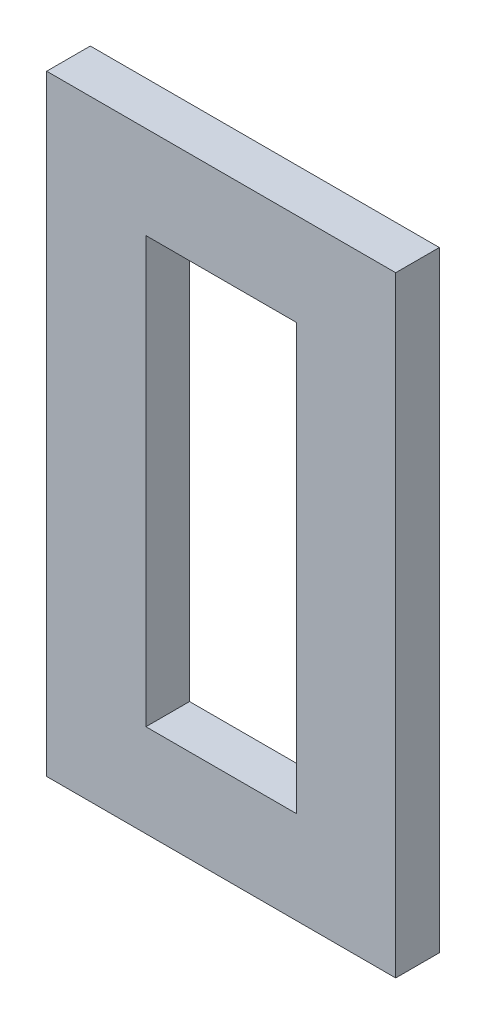
ISO-10303-21;
HEADER;
FILE_DESCRIPTION(('STEP AP214'),'2;1');
FILE_NAME('part.step','',(''),(''),'','','');
FILE_SCHEMA(('AUTOMOTIVE_DESIGN { 1 0 10303 214 1 1 1 1 }'));
ENDSEC;
DATA;
#1=APPLICATION_CONTEXT('core data for automotive mechanical design processes');
#2=APPLICATION_PROTOCOL_DEFINITION('international standard','automotive_design',2000,#1);
#3=PRODUCT_CONTEXT('',#1,'mechanical');
#4=PRODUCT('Part','Part','',(#3));
#5=PRODUCT_RELATED_PRODUCT_CATEGORY('part','',(#4));
#6=PRODUCT_DEFINITION_FORMATION('','',#4);
#7=PRODUCT_DEFINITION_CONTEXT('part definition',#1,'design');
#8=PRODUCT_DEFINITION('design','',#6,#7);
#9=PRODUCT_DEFINITION_SHAPE('','',#8);
#10=(LENGTH_UNIT() NAMED_UNIT(*) SI_UNIT(.MILLI.,.METRE.));
#11=(NAMED_UNIT(*) PLANE_ANGLE_UNIT() SI_UNIT($,.RADIAN.));
#12=(NAMED_UNIT(*) SI_UNIT($,.STERADIAN.) SOLID_ANGLE_UNIT());
#13=UNCERTAINTY_MEASURE_WITH_UNIT(LENGTH_MEASURE(1.E-05),#10,'distance_accuracy_value','');
#14=(GEOMETRIC_REPRESENTATION_CONTEXT(3) GLOBAL_UNCERTAINTY_ASSIGNED_CONTEXT((#13)) GLOBAL_UNIT_ASSIGNED_CONTEXT((#10,
#11,#12)) REPRESENTATION_CONTEXT('',''));
#15=CARTESIAN_POINT('',(0.,0.,0.));
#16=DIRECTION('',(0.,0.,1.));
#17=DIRECTION('',(1.,0.,0.));
#18=AXIS2_PLACEMENT_3D('',#15,#16,#17);
#19=CARTESIAN_POINT('',(0.,0.,20.));
#20=DIRECTION('',(0.,0.,-1.));
#21=DIRECTION('',(-1.,0.,0.));
#22=AXIS2_PLACEMENT_3D('',#19,#20,#21);
#23=PLANE('',#22);
#24=DIRECTION('',(0.,-1.,0.));
#25=VECTOR('',#24,1.);
#26=CARTESIAN_POINT('',(-291.827956989247,-140.,20.));
#27=LINE('',#26,#25);
#28=CARTESIAN_POINT('',(-291.827956989247,140.,20.));
#29=VERTEX_POINT('',#28);
#30=CARTESIAN_POINT('',(-291.827956989247,-140.,20.));
#31=VERTEX_POINT('',#30);
#32=EDGE_CURVE('E142',#29,#31,#27,.T.);
#33=ORIENTED_EDGE('',*,*,#32,.T.);
#34=DIRECTION('',(1.,0.,0.));
#35=VECTOR('',#34,1.);
#36=CARTESIAN_POINT('',(-131.827956989247,-140.,20.));
#37=LINE('',#36,#35);
#38=CARTESIAN_POINT('',(-131.827956989247,-140.,20.));
#39=VERTEX_POINT('',#38);
#40=EDGE_CURVE('E145',#31,#39,#37,.T.);
#41=ORIENTED_EDGE('',*,*,#40,.T.);
#42=DIRECTION('',(0.,1.,0.));
#43=VECTOR('',#42,1.);
#44=CARTESIAN_POINT('',(-131.827956989247,140.,20.));
#45=LINE('',#44,#43);
#46=CARTESIAN_POINT('',(-131.827956989247,140.,20.));
#47=VERTEX_POINT('',#46);
#48=EDGE_CURVE('E148',#39,#47,#45,.T.);
#49=ORIENTED_EDGE('',*,*,#48,.T.);
#50=DIRECTION('',(-1.,0.,0.));
#51=VECTOR('',#50,1.);
#52=CARTESIAN_POINT('',(-291.827956989247,140.,20.));
#53=LINE('',#52,#51);
#54=EDGE_CURVE('E150',#47,#29,#53,.T.);
#55=ORIENTED_EDGE('',*,*,#54,.T.);
#56=EDGE_LOOP('',(#33,#41,#49,#55));
#57=FACE_BOUND('',#56,.T.);
#58=DIRECTION('',(0.,1.,0.));
#59=VECTOR('',#58,1.);
#60=CARTESIAN_POINT('',(-177.327956989247,97.5,20.));
#61=LINE('',#60,#59);
#62=CARTESIAN_POINT('',(-177.327956989247,-97.5,20.));
#63=VERTEX_POINT('',#62);
#64=CARTESIAN_POINT('',(-177.327956989247,97.5,20.));
#65=VERTEX_POINT('',#64);
#66=EDGE_CURVE('E106',#63,#65,#61,.T.);
#67=ORIENTED_EDGE('',*,*,#66,.F.);
#68=DIRECTION('',(1.,0.,0.));
#69=VECTOR('',#68,1.);
#70=CARTESIAN_POINT('',(-246.327956989247,-97.5,20.));
#71=LINE('',#70,#69);
#72=CARTESIAN_POINT('',(-246.327956989247,-97.5,20.));
#73=VERTEX_POINT('',#72);
#74=EDGE_CURVE('E128',#73,#63,#71,.T.);
#75=ORIENTED_EDGE('',*,*,#74,.F.);
#76=DIRECTION('',(0.,-1.,0.));
#77=VECTOR('',#76,1.);
#78=CARTESIAN_POINT('',(-246.327956989247,97.5,20.));
#79=LINE('',#78,#77);
#80=CARTESIAN_POINT('',(-246.327956989247,97.5,20.));
#81=VERTEX_POINT('',#80);
#82=EDGE_CURVE('E126',#81,#73,#79,.T.);
#83=ORIENTED_EDGE('',*,*,#82,.F.);
#84=DIRECTION('',(-1.,0.,0.));
#85=VECTOR('',#84,1.);
#86=CARTESIAN_POINT('',(-246.327956989247,97.5,20.));
#87=LINE('',#86,#85);
#88=EDGE_CURVE('E114',#65,#81,#87,.T.);
#89=ORIENTED_EDGE('',*,*,#88,.F.);
#90=EDGE_LOOP('',(#67,#75,#83,#89));
#91=FACE_BOUND('',#90,.T.);
#92=ADVANCED_FACE('F41',(#57,#91),#23,.F.);
#93=CARTESIAN_POINT('',(0.,0.,0.));
#94=DIRECTION('',(0.,0.,-1.));
#95=DIRECTION('',(-1.,0.,0.));
#96=AXIS2_PLACEMENT_3D('',#93,#94,#95);
#97=PLANE('',#96);
#98=DIRECTION('',(0.,-1.,0.));
#99=VECTOR('',#98,1.);
#100=CARTESIAN_POINT('',(-291.827956989247,-140.,0.));
#101=LINE('',#100,#99);
#102=CARTESIAN_POINT('',(-291.827956989247,140.,0.));
#103=VERTEX_POINT('',#102);
#104=CARTESIAN_POINT('',(-291.827956989247,-140.,0.));
#105=VERTEX_POINT('',#104);
#106=EDGE_CURVE('E122',#103,#105,#101,.T.);
#107=ORIENTED_EDGE('',*,*,#106,.F.);
#108=DIRECTION('',(-1.,0.,0.));
#109=VECTOR('',#108,1.);
#110=CARTESIAN_POINT('',(-291.827956989247,140.,0.));
#111=LINE('',#110,#109);
#112=CARTESIAN_POINT('',(-131.827956989247,140.,0.));
#113=VERTEX_POINT('',#112);
#114=EDGE_CURVE('E146',#113,#103,#111,.T.);
#115=ORIENTED_EDGE('',*,*,#114,.F.);
#116=DIRECTION('',(0.,1.,0.));
#117=VECTOR('',#116,1.);
#118=CARTESIAN_POINT('',(-131.827956989247,140.,0.));
#119=LINE('',#118,#117);
#120=CARTESIAN_POINT('',(-131.827956989247,-140.,0.));
#121=VERTEX_POINT('',#120);
#122=EDGE_CURVE('E157',#121,#113,#119,.T.);
#123=ORIENTED_EDGE('',*,*,#122,.F.);
#124=DIRECTION('',(1.,0.,0.));
#125=VECTOR('',#124,1.);
#126=CARTESIAN_POINT('',(-131.827956989247,-140.,0.));
#127=LINE('',#126,#125);
#128=EDGE_CURVE('E155',#105,#121,#127,.T.);
#129=ORIENTED_EDGE('',*,*,#128,.F.);
#130=EDGE_LOOP('',(#107,#115,#123,#129));
#131=FACE_BOUND('',#130,.T.);
#132=DIRECTION('',(1.,0.,0.));
#133=VECTOR('',#132,1.);
#134=CARTESIAN_POINT('',(-246.327956989247,-97.5,0.));
#135=LINE('',#134,#133);
#136=CARTESIAN_POINT('',(-246.327956989247,-97.5,0.));
#137=VERTEX_POINT('',#136);
#138=CARTESIAN_POINT('',(-177.327956989247,-97.5,0.));
#139=VERTEX_POINT('',#138);
#140=EDGE_CURVE('E115',#137,#139,#135,.T.);
#141=ORIENTED_EDGE('',*,*,#140,.T.);
#142=DIRECTION('',(0.,1.,0.));
#143=VECTOR('',#142,1.);
#144=CARTESIAN_POINT('',(-177.327956989247,97.5,0.));
#145=LINE('',#144,#143);
#146=CARTESIAN_POINT('',(-177.327956989247,97.5,0.));
#147=VERTEX_POINT('',#146);
#148=EDGE_CURVE('E64',#139,#147,#145,.T.);
#149=ORIENTED_EDGE('',*,*,#148,.T.);
#150=DIRECTION('',(-1.,0.,0.));
#151=VECTOR('',#150,1.);
#152=CARTESIAN_POINT('',(-246.327956989247,97.5,0.));
#153=LINE('',#152,#151);
#154=CARTESIAN_POINT('',(-246.327956989247,97.5,0.));
#155=VERTEX_POINT('',#154);
#156=EDGE_CURVE('E121',#147,#155,#153,.T.);
#157=ORIENTED_EDGE('',*,*,#156,.T.);
#158=DIRECTION('',(0.,-1.,0.));
#159=VECTOR('',#158,1.);
#160=CARTESIAN_POINT('',(-246.327956989247,97.5,0.));
#161=LINE('',#160,#159);
#162=EDGE_CURVE('E134',#155,#137,#161,.T.);
#163=ORIENTED_EDGE('',*,*,#162,.T.);
#164=EDGE_LOOP('',(#141,#149,#157,#163));
#165=FACE_BOUND('',#164,.T.);
#166=ADVANCED_FACE('F175',(#131,#165),#97,.T.);
#167=CARTESIAN_POINT('',(-291.827956989247,-140.,20.));
#168=DIRECTION('',(1.,0.,0.));
#169=DIRECTION('',(0.,0.,-1.));
#170=AXIS2_PLACEMENT_3D('',#167,#168,#169);
#171=PLANE('',#170);
#172=ORIENTED_EDGE('',*,*,#106,.T.);
#173=DIRECTION('',(0.,0.,-1.));
#174=VECTOR('',#173,1.);
#175=CARTESIAN_POINT('',(-291.827956989247,-140.,20.));
#176=LINE('',#175,#174);
#177=EDGE_CURVE('E11',#31,#105,#176,.T.);
#178=ORIENTED_EDGE('',*,*,#177,.F.);
#179=ORIENTED_EDGE('',*,*,#32,.F.);
#180=DIRECTION('',(0.,0.,-1.));
#181=VECTOR('',#180,1.);
#182=CARTESIAN_POINT('',(-291.827956989247,140.,20.));
#183=LINE('',#182,#181);
#184=EDGE_CURVE('E152',#29,#103,#183,.T.);
#185=ORIENTED_EDGE('',*,*,#184,.T.);
#186=EDGE_LOOP('',(#172,#178,#179,#185));
#187=FACE_BOUND('',#186,.T.);
#188=ADVANCED_FACE('F43',(#187),#171,.F.);
#189=CARTESIAN_POINT('',(-131.827956989247,-140.,20.));
#190=DIRECTION('',(0.,1.,0.));
#191=DIRECTION('',(0.,0.,1.));
#192=AXIS2_PLACEMENT_3D('',#189,#190,#191);
#193=PLANE('',#192);
#194=ORIENTED_EDGE('',*,*,#128,.T.);
#195=DIRECTION('',(0.,0.,-1.));
#196=VECTOR('',#195,1.);
#197=CARTESIAN_POINT('',(-131.827956989247,-140.,20.));
#198=LINE('',#197,#196);
#199=EDGE_CURVE('E49',#39,#121,#198,.T.);
#200=ORIENTED_EDGE('',*,*,#199,.F.);
#201=ORIENTED_EDGE('',*,*,#40,.F.);
#202=ORIENTED_EDGE('',*,*,#177,.T.);
#203=EDGE_LOOP('',(#194,#200,#201,#202));
#204=FACE_BOUND('',#203,.T.);
#205=ADVANCED_FACE('F185',(#204),#193,.F.);
#206=CARTESIAN_POINT('',(-131.827956989247,140.,20.));
#207=DIRECTION('',(-1.,0.,0.));
#208=DIRECTION('',(0.,-1.,0.));
#209=AXIS2_PLACEMENT_3D('',#206,#207,#208);
#210=PLANE('',#209);
#211=ORIENTED_EDGE('',*,*,#122,.T.);
#212=DIRECTION('',(0.,0.,-1.));
#213=VECTOR('',#212,1.);
#214=CARTESIAN_POINT('',(-131.827956989247,140.,20.));
#215=LINE('',#214,#213);
#216=EDGE_CURVE('E162',#47,#113,#215,.T.);
#217=ORIENTED_EDGE('',*,*,#216,.F.);
#218=ORIENTED_EDGE('',*,*,#48,.F.);
#219=ORIENTED_EDGE('',*,*,#199,.T.);
#220=EDGE_LOOP('',(#211,#217,#218,#219));
#221=FACE_BOUND('',#220,.T.);
#222=ADVANCED_FACE('F169',(#221),#210,.F.);
#223=CARTESIAN_POINT('',(-291.827956989247,140.,20.));
#224=DIRECTION('',(0.,-1.,0.));
#225=DIRECTION('',(0.,0.,-1.));
#226=AXIS2_PLACEMENT_3D('',#223,#224,#225);
#227=PLANE('',#226);
#228=ORIENTED_EDGE('',*,*,#114,.T.);
#229=ORIENTED_EDGE('',*,*,#184,.F.);
#230=ORIENTED_EDGE('',*,*,#54,.F.);
#231=ORIENTED_EDGE('',*,*,#216,.T.);
#232=EDGE_LOOP('',(#228,#229,#230,#231));
#233=FACE_BOUND('',#232,.T.);
#234=ADVANCED_FACE('F179',(#233),#227,.F.);
#235=CARTESIAN_POINT('',(-177.327956989247,97.5,20.));
#236=DIRECTION('',(-1.,0.,0.));
#237=DIRECTION('',(0.,-1.,0.));
#238=AXIS2_PLACEMENT_3D('',#235,#236,#237);
#239=PLANE('',#238);
#240=ORIENTED_EDGE('',*,*,#148,.F.);
#241=DIRECTION('',(0.,0.,-1.));
#242=VECTOR('',#241,1.);
#243=CARTESIAN_POINT('',(-177.327956989247,-97.5,20.));
#244=LINE('',#243,#242);
#245=EDGE_CURVE('E110',#63,#139,#244,.T.);
#246=ORIENTED_EDGE('',*,*,#245,.F.);
#247=ORIENTED_EDGE('',*,*,#66,.T.);
#248=DIRECTION('',(0.,0.,-1.));
#249=VECTOR('',#248,1.);
#250=CARTESIAN_POINT('',(-177.327956989247,97.5,20.));
#251=LINE('',#250,#249);
#252=EDGE_CURVE('E109',#65,#147,#251,.T.);
#253=ORIENTED_EDGE('',*,*,#252,.T.);
#254=EDGE_LOOP('',(#240,#246,#247,#253));
#255=FACE_BOUND('',#254,.T.);
#256=ADVANCED_FACE('F108',(#255),#239,.T.);
#257=CARTESIAN_POINT('',(-246.327956989247,97.5,20.));
#258=DIRECTION('',(0.,-1.,0.));
#259=DIRECTION('',(0.,0.,-1.));
#260=AXIS2_PLACEMENT_3D('',#257,#258,#259);
#261=PLANE('',#260);
#262=ORIENTED_EDGE('',*,*,#156,.F.);
#263=ORIENTED_EDGE('',*,*,#252,.F.);
#264=ORIENTED_EDGE('',*,*,#88,.T.);
#265=DIRECTION('',(0.,0.,-1.));
#266=VECTOR('',#265,1.);
#267=CARTESIAN_POINT('',(-246.327956989247,97.5,20.));
#268=LINE('',#267,#266);
#269=EDGE_CURVE('E123',#81,#155,#268,.T.);
#270=ORIENTED_EDGE('',*,*,#269,.T.);
#271=EDGE_LOOP('',(#262,#263,#264,#270));
#272=FACE_BOUND('',#271,.T.);
#273=ADVANCED_FACE('F118',(#272),#261,.T.);
#274=CARTESIAN_POINT('',(-246.327956989247,97.5,20.));
#275=DIRECTION('',(1.,0.,0.));
#276=DIRECTION('',(0.,0.,-1.));
#277=AXIS2_PLACEMENT_3D('',#274,#275,#276);
#278=PLANE('',#277);
#279=ORIENTED_EDGE('',*,*,#162,.F.);
#280=ORIENTED_EDGE('',*,*,#269,.F.);
#281=ORIENTED_EDGE('',*,*,#82,.T.);
#282=DIRECTION('',(0.,0.,-1.));
#283=VECTOR('',#282,1.);
#284=CARTESIAN_POINT('',(-246.327956989247,-97.5,20.));
#285=LINE('',#284,#283);
#286=EDGE_CURVE('E56',#73,#137,#285,.T.);
#287=ORIENTED_EDGE('',*,*,#286,.T.);
#288=EDGE_LOOP('',(#279,#280,#281,#287));
#289=FACE_BOUND('',#288,.T.);
#290=ADVANCED_FACE('F208',(#289),#278,.T.);
#291=CARTESIAN_POINT('',(-246.327956989247,-97.5,20.));
#292=DIRECTION('',(0.,1.,0.));
#293=DIRECTION('',(0.,0.,1.));
#294=AXIS2_PLACEMENT_3D('',#291,#292,#293);
#295=PLANE('',#294);
#296=ORIENTED_EDGE('',*,*,#140,.F.);
#297=ORIENTED_EDGE('',*,*,#286,.F.);
#298=ORIENTED_EDGE('',*,*,#74,.T.);
#299=ORIENTED_EDGE('',*,*,#245,.T.);
#300=EDGE_LOOP('',(#296,#297,#298,#299));
#301=FACE_BOUND('',#300,.T.);
#302=ADVANCED_FACE('F212',(#301),#295,.T.);
#303=CLOSED_SHELL('',(#92,#166,#188,#205,#222,#234,#256,#273,#290,#302));
#304=MANIFOLD_SOLID_BREP('B2',#303);
#305=ADVANCED_BREP_SHAPE_REPRESENTATION('',(#18,#304),#14);
#306=SHAPE_DEFINITION_REPRESENTATION(#9,#305);
ENDSEC;
END-ISO-10303-21;
